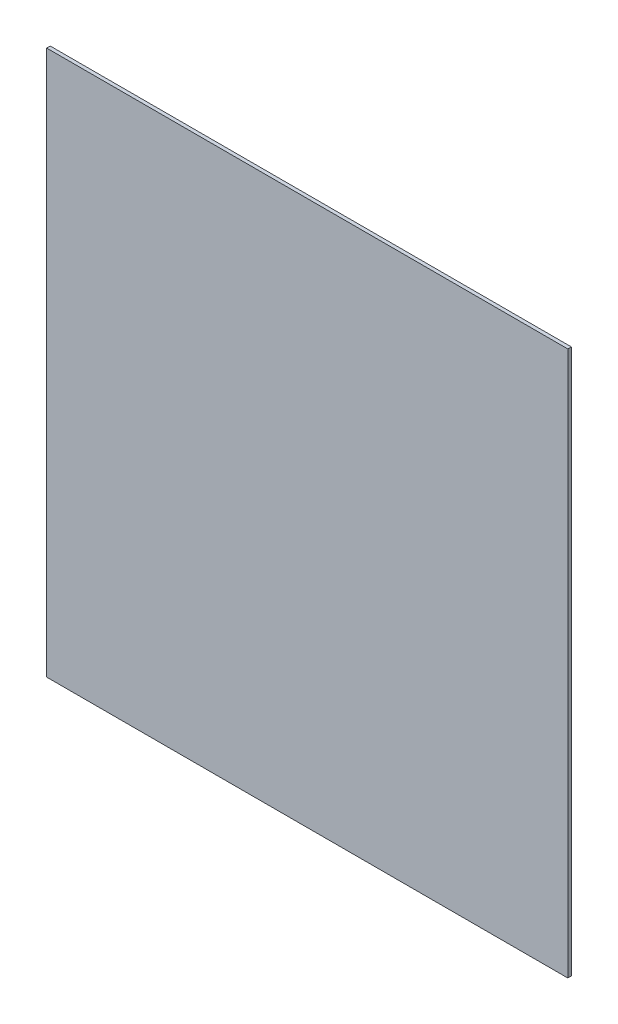
ISO-10303-21;
HEADER;
FILE_DESCRIPTION(('STEP AP214'),'2;1');
FILE_NAME('part.step','',(''),(''),'','','');
FILE_SCHEMA(('AUTOMOTIVE_DESIGN { 1 0 10303 214 1 1 1 1 }'));
ENDSEC;
DATA;
#1=APPLICATION_CONTEXT('core data for automotive mechanical design processes');
#2=APPLICATION_PROTOCOL_DEFINITION('international standard','automotive_design',2000,#1);
#3=PRODUCT_CONTEXT('',#1,'mechanical');
#4=PRODUCT('Part','Part','',(#3));
#5=PRODUCT_RELATED_PRODUCT_CATEGORY('part','',(#4));
#6=PRODUCT_DEFINITION_FORMATION('','',#4);
#7=PRODUCT_DEFINITION_CONTEXT('part definition',#1,'design');
#8=PRODUCT_DEFINITION('design','',#6,#7);
#9=PRODUCT_DEFINITION_SHAPE('','',#8);
#10=(LENGTH_UNIT() NAMED_UNIT(*) SI_UNIT(.MILLI.,.METRE.));
#11=(NAMED_UNIT(*) PLANE_ANGLE_UNIT() SI_UNIT($,.RADIAN.));
#12=(NAMED_UNIT(*) SI_UNIT($,.STERADIAN.) SOLID_ANGLE_UNIT());
#13=UNCERTAINTY_MEASURE_WITH_UNIT(LENGTH_MEASURE(1.E-05),#10,'distance_accuracy_value','');
#14=(GEOMETRIC_REPRESENTATION_CONTEXT(3) GLOBAL_UNCERTAINTY_ASSIGNED_CONTEXT((#13)) GLOBAL_UNIT_ASSIGNED_CONTEXT((#10,
#11,#12)) REPRESENTATION_CONTEXT('',''));
#15=CARTESIAN_POINT('',(0.,0.,0.));
#16=DIRECTION('',(0.,0.,1.));
#17=DIRECTION('',(1.,0.,0.));
#18=AXIS2_PLACEMENT_3D('',#15,#16,#17);
#19=CARTESIAN_POINT('',(-220.,230.,3.));
#20=DIRECTION('',(1.,0.,0.));
#21=DIRECTION('',(0.,1.,0.));
#22=AXIS2_PLACEMENT_3D('',#19,#20,#21);
#23=PLANE('',#22);
#24=DIRECTION('',(0.,-1.,0.));
#25=VECTOR('',#24,1.);
#26=CARTESIAN_POINT('',(-220.,230.,0.));
#27=LINE('',#26,#25);
#28=CARTESIAN_POINT('',(-220.,230.,0.));
#29=VERTEX_POINT('',#28);
#30=CARTESIAN_POINT('',(-220.,-230.,0.));
#31=VERTEX_POINT('',#30);
#32=EDGE_CURVE('E96',#29,#31,#27,.T.);
#33=ORIENTED_EDGE('',*,*,#32,.T.);
#34=DIRECTION('',(0.,0.,-1.));
#35=VECTOR('',#34,1.);
#36=CARTESIAN_POINT('',(-220.,-230.,3.));
#37=LINE('',#36,#35);
#38=CARTESIAN_POINT('',(-220.,-230.,3.));
#39=VERTEX_POINT('',#38);
#40=EDGE_CURVE('E11',#39,#31,#37,.T.);
#41=ORIENTED_EDGE('',*,*,#40,.F.);
#42=DIRECTION('',(0.,-1.,0.));
#43=VECTOR('',#42,1.);
#44=CARTESIAN_POINT('',(-220.,230.,3.));
#45=LINE('',#44,#43);
#46=CARTESIAN_POINT('',(-220.,230.,3.));
#47=VERTEX_POINT('',#46);
#48=EDGE_CURVE('E84',#47,#39,#45,.T.);
#49=ORIENTED_EDGE('',*,*,#48,.F.);
#50=DIRECTION('',(0.,0.,-1.));
#51=VECTOR('',#50,1.);
#52=CARTESIAN_POINT('',(-220.,230.,3.));
#53=LINE('',#52,#51);
#54=EDGE_CURVE('E92',#47,#29,#53,.T.);
#55=ORIENTED_EDGE('',*,*,#54,.T.);
#56=EDGE_LOOP('',(#33,#41,#49,#55));
#57=FACE_BOUND('',#56,.T.);
#58=ADVANCED_FACE('F33',(#57),#23,.F.);
#59=CARTESIAN_POINT('',(-220.,-230.,3.));
#60=DIRECTION('',(0.,1.,0.));
#61=DIRECTION('',(-1.,0.,0.));
#62=AXIS2_PLACEMENT_3D('',#59,#60,#61);
#63=PLANE('',#62);
#64=DIRECTION('',(1.,0.,0.));
#65=VECTOR('',#64,1.);
#66=CARTESIAN_POINT('',(-220.,-230.,0.));
#67=LINE('',#66,#65);
#68=CARTESIAN_POINT('',(220.,-230.,0.));
#69=VERTEX_POINT('',#68);
#70=EDGE_CURVE('E88',#31,#69,#67,.T.);
#71=ORIENTED_EDGE('',*,*,#70,.T.);
#72=DIRECTION('',(0.,0.,-1.));
#73=VECTOR('',#72,1.);
#74=CARTESIAN_POINT('',(220.,-230.,3.));
#75=LINE('',#74,#73);
#76=CARTESIAN_POINT('',(220.,-230.,3.));
#77=VERTEX_POINT('',#76);
#78=EDGE_CURVE('E41',#77,#69,#75,.T.);
#79=ORIENTED_EDGE('',*,*,#78,.F.);
#80=DIRECTION('',(1.,0.,0.));
#81=VECTOR('',#80,1.);
#82=CARTESIAN_POINT('',(-220.,-230.,3.));
#83=LINE('',#82,#81);
#84=EDGE_CURVE('E79',#39,#77,#83,.T.);
#85=ORIENTED_EDGE('',*,*,#84,.F.);
#86=ORIENTED_EDGE('',*,*,#40,.T.);
#87=EDGE_LOOP('',(#71,#79,#85,#86));
#88=FACE_BOUND('',#87,.T.);
#89=ADVANCED_FACE('F87',(#88),#63,.F.);
#90=CARTESIAN_POINT('',(220.,230.,3.));
#91=DIRECTION('',(-1.,0.,0.));
#92=DIRECTION('',(0.,-1.,0.));
#93=AXIS2_PLACEMENT_3D('',#90,#91,#92);
#94=PLANE('',#93);
#95=DIRECTION('',(0.,1.,0.));
#96=VECTOR('',#95,1.);
#97=CARTESIAN_POINT('',(220.,230.,0.));
#98=LINE('',#97,#96);
#99=CARTESIAN_POINT('',(220.,230.,0.));
#100=VERTEX_POINT('',#99);
#101=EDGE_CURVE('E66',#69,#100,#98,.T.);
#102=ORIENTED_EDGE('',*,*,#101,.T.);
#103=DIRECTION('',(0.,0.,-1.));
#104=VECTOR('',#103,1.);
#105=CARTESIAN_POINT('',(220.,230.,3.));
#106=LINE('',#105,#104);
#107=CARTESIAN_POINT('',(220.,230.,3.));
#108=VERTEX_POINT('',#107);
#109=EDGE_CURVE('E89',#108,#100,#106,.T.);
#110=ORIENTED_EDGE('',*,*,#109,.F.);
#111=DIRECTION('',(0.,1.,0.));
#112=VECTOR('',#111,1.);
#113=CARTESIAN_POINT('',(220.,230.,3.));
#114=LINE('',#113,#112);
#115=EDGE_CURVE('E82',#77,#108,#114,.T.);
#116=ORIENTED_EDGE('',*,*,#115,.F.);
#117=ORIENTED_EDGE('',*,*,#78,.T.);
#118=EDGE_LOOP('',(#102,#110,#116,#117));
#119=FACE_BOUND('',#118,.T.);
#120=ADVANCED_FACE('F90',(#119),#94,.F.);
#121=CARTESIAN_POINT('',(-220.,230.,3.));
#122=DIRECTION('',(0.,-1.,0.));
#123=DIRECTION('',(1.,0.,0.));
#124=AXIS2_PLACEMENT_3D('',#121,#122,#123);
#125=PLANE('',#124);
#126=DIRECTION('',(-1.,0.,0.));
#127=VECTOR('',#126,1.);
#128=CARTESIAN_POINT('',(-220.,230.,0.));
#129=LINE('',#128,#127);
#130=EDGE_CURVE('E72',#100,#29,#129,.T.);
#131=ORIENTED_EDGE('',*,*,#130,.T.);
#132=ORIENTED_EDGE('',*,*,#54,.F.);
#133=DIRECTION('',(-1.,0.,0.));
#134=VECTOR('',#133,1.);
#135=CARTESIAN_POINT('',(-220.,230.,3.));
#136=LINE('',#135,#134);
#137=EDGE_CURVE('E49',#108,#47,#136,.T.);
#138=ORIENTED_EDGE('',*,*,#137,.F.);
#139=ORIENTED_EDGE('',*,*,#109,.T.);
#140=EDGE_LOOP('',(#131,#132,#138,#139));
#141=FACE_BOUND('',#140,.T.);
#142=ADVANCED_FACE('F103',(#141),#125,.F.);
#143=CARTESIAN_POINT('',(0.,0.,3.));
#144=DIRECTION('',(0.,0.,1.));
#145=DIRECTION('',(1.,0.,0.));
#146=AXIS2_PLACEMENT_3D('',#143,#144,#145);
#147=PLANE('',#146);
#148=ORIENTED_EDGE('',*,*,#48,.T.);
#149=ORIENTED_EDGE('',*,*,#84,.T.);
#150=ORIENTED_EDGE('',*,*,#115,.T.);
#151=ORIENTED_EDGE('',*,*,#137,.T.);
#152=EDGE_LOOP('',(#148,#149,#150,#151));
#153=FACE_BOUND('',#152,.T.);
#154=ADVANCED_FACE('F80',(#153),#147,.T.);
#155=CARTESIAN_POINT('',(0.,0.,0.));
#156=DIRECTION('',(0.,0.,1.));
#157=DIRECTION('',(1.,0.,0.));
#158=AXIS2_PLACEMENT_3D('',#155,#156,#157);
#159=PLANE('',#158);
#160=ORIENTED_EDGE('',*,*,#32,.F.);
#161=ORIENTED_EDGE('',*,*,#130,.F.);
#162=ORIENTED_EDGE('',*,*,#101,.F.);
#163=ORIENTED_EDGE('',*,*,#70,.F.);
#164=EDGE_LOOP('',(#160,#161,#162,#163));
#165=FACE_BOUND('',#164,.T.);
#166=ADVANCED_FACE('F106',(#165),#159,.F.);
#167=CLOSED_SHELL('',(#58,#89,#120,#142,#154,#166));
#168=MANIFOLD_SOLID_BREP('B2',#167);
#169=ADVANCED_BREP_SHAPE_REPRESENTATION('',(#18,#168),#14);
#170=SHAPE_DEFINITION_REPRESENTATION(#9,#169);
ENDSEC;
END-ISO-10303-21;
